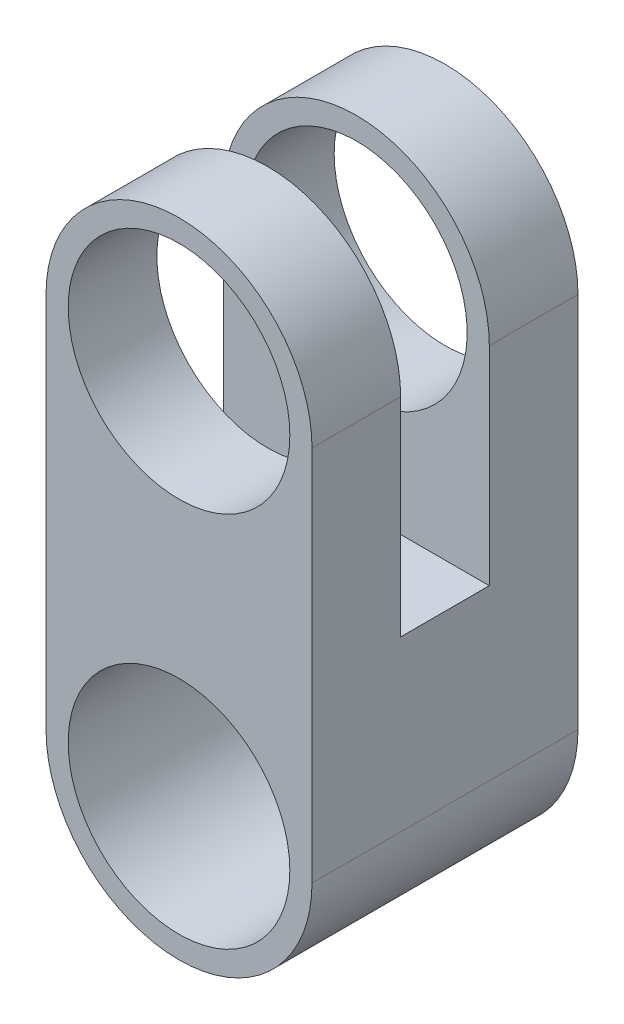
ISO-10303-21;
HEADER;
FILE_DESCRIPTION(('STEP AP214'),'2;1');
FILE_NAME('part.step','',(''),(''),'','','');
FILE_SCHEMA(('AUTOMOTIVE_DESIGN { 1 0 10303 214 1 1 1 1 }'));
ENDSEC;
DATA;
#1=APPLICATION_CONTEXT('core data for automotive mechanical design processes');
#2=APPLICATION_PROTOCOL_DEFINITION('international standard','automotive_design',2000,#1);
#3=PRODUCT_CONTEXT('',#1,'mechanical');
#4=PRODUCT('Part','Part','',(#3));
#5=PRODUCT_RELATED_PRODUCT_CATEGORY('part','',(#4));
#6=PRODUCT_DEFINITION_FORMATION('','',#4);
#7=PRODUCT_DEFINITION_CONTEXT('part definition',#1,'design');
#8=PRODUCT_DEFINITION('design','',#6,#7);
#9=PRODUCT_DEFINITION_SHAPE('','',#8);
#10=(LENGTH_UNIT() NAMED_UNIT(*) SI_UNIT(.MILLI.,.METRE.));
#11=(NAMED_UNIT(*) PLANE_ANGLE_UNIT() SI_UNIT($,.RADIAN.));
#12=(NAMED_UNIT(*) SI_UNIT($,.STERADIAN.) SOLID_ANGLE_UNIT());
#13=UNCERTAINTY_MEASURE_WITH_UNIT(LENGTH_MEASURE(1.E-05),#10,'distance_accuracy_value','');
#14=(GEOMETRIC_REPRESENTATION_CONTEXT(3) GLOBAL_UNCERTAINTY_ASSIGNED_CONTEXT((#13)) GLOBAL_UNIT_ASSIGNED_CONTEXT((#10,
#11,#12)) REPRESENTATION_CONTEXT('',''));
#15=CARTESIAN_POINT('',(0.,0.,0.));
#16=DIRECTION('',(0.,0.,1.));
#17=DIRECTION('',(1.,0.,0.));
#18=AXIS2_PLACEMENT_3D('',#15,#16,#17);
#19=CARTESIAN_POINT('',(0.,37.0662206937284,6.));
#20=DIRECTION('',(0.,0.,-1.));
#21=DIRECTION('',(-1.,0.,0.));
#22=AXIS2_PLACEMENT_3D('',#19,#20,#21);
#23=CYLINDRICAL_SURFACE('',#22,3.);
#24=DIRECTION('',(0.,0.,-1.));
#25=VECTOR('',#24,1.);
#26=CARTESIAN_POINT('',(-3.,37.0662206937284,6.));
#27=LINE('',#26,#25);
#28=CARTESIAN_POINT('',(-3.,37.0662206937284,2.));
#29=VERTEX_POINT('',#28);
#30=CARTESIAN_POINT('',(-3.,37.0662206937284,0.));
#31=VERTEX_POINT('',#30);
#32=EDGE_CURVE('E49',#29,#31,#27,.T.);
#33=ORIENTED_EDGE('',*,*,#32,.F.);
#34=CARTESIAN_POINT('',(0.,37.0662206937284,2.));
#35=DIRECTION('',(0.,0.,-1.));
#36=DIRECTION('',(-1.,0.,0.));
#37=AXIS2_PLACEMENT_3D('',#34,#35,#36);
#38=CIRCLE('',#37,3.);
#39=CARTESIAN_POINT('',(3.,37.0662206937284,2.));
#40=VERTEX_POINT('',#39);
#41=EDGE_CURVE('E156',#29,#40,#38,.T.);
#42=ORIENTED_EDGE('',*,*,#41,.T.);
#43=DIRECTION('',(0.,0.,-1.));
#44=VECTOR('',#43,1.);
#45=CARTESIAN_POINT('',(3.,37.0662206937284,6.));
#46=LINE('',#45,#44);
#47=CARTESIAN_POINT('',(3.,37.0662206937284,0.));
#48=VERTEX_POINT('',#47);
#49=EDGE_CURVE('E88',#40,#48,#46,.T.);
#50=ORIENTED_EDGE('',*,*,#49,.T.);
#51=CARTESIAN_POINT('',(0.,37.0662206937284,0.));
#52=DIRECTION('',(0.,0.,1.));
#53=DIRECTION('',(1.,0.,0.));
#54=AXIS2_PLACEMENT_3D('',#51,#52,#53);
#55=CIRCLE('',#54,3.);
#56=EDGE_CURVE('E172',#48,#31,#55,.T.);
#57=ORIENTED_EDGE('',*,*,#56,.T.);
#58=EDGE_LOOP('',(#33,#42,#50,#57));
#59=FACE_BOUND('',#58,.T.);
#60=ADVANCED_FACE('F39',(#59),#23,.T.);
#61=CARTESIAN_POINT('',(0.,37.0662206937284,6.));
#62=DIRECTION('',(0.,0.,-1.));
#63=DIRECTION('',(-1.,0.,0.));
#64=AXIS2_PLACEMENT_3D('',#61,#62,#63);
#65=CYLINDRICAL_SURFACE('',#64,2.5);
#66=CARTESIAN_POINT('',(0.,37.0662206937284,2.));
#67=DIRECTION('',(0.,0.,-1.));
#68=DIRECTION('',(-1.,0.,0.));
#69=AXIS2_PLACEMENT_3D('',#66,#67,#68);
#70=CIRCLE('',#69,2.5);
#71=CARTESIAN_POINT('',(-2.5,37.0662206937284,2.));
#72=VERTEX_POINT('',#71);
#73=EDGE_CURVE('E43',#72,#72,#70,.T.);
#74=ORIENTED_EDGE('',*,*,#73,.F.);
#75=EDGE_LOOP('',(#74));
#76=FACE_BOUND('',#75,.T.);
#77=CARTESIAN_POINT('',(0.,37.0662206937284,0.));
#78=DIRECTION('',(0.,0.,1.));
#79=DIRECTION('',(1.,0.,0.));
#80=AXIS2_PLACEMENT_3D('',#77,#78,#79);
#81=CIRCLE('',#80,2.5);
#82=CARTESIAN_POINT('',(2.5,37.0662206937284,0.));
#83=VERTEX_POINT('',#82);
#84=EDGE_CURVE('E164',#83,#83,#81,.T.);
#85=ORIENTED_EDGE('',*,*,#84,.F.);
#86=EDGE_LOOP('',(#85));
#87=FACE_BOUND('',#86,.T.);
#88=ADVANCED_FACE('F219',(#76,#87),#65,.F.);
#89=CARTESIAN_POINT('',(0.,37.0662206937284,6.));
#90=DIRECTION('',(0.,0.,1.));
#91=DIRECTION('',(1.,0.,0.));
#92=AXIS2_PLACEMENT_3D('',#89,#90,#91);
#93=PLANE('',#92);
#94=CARTESIAN_POINT('',(0.,37.0662206937284,6.));
#95=DIRECTION('',(0.,0.,1.));
#96=DIRECTION('',(1.,0.,0.));
#97=AXIS2_PLACEMENT_3D('',#94,#95,#96);
#98=CIRCLE('',#97,2.5);
#99=CARTESIAN_POINT('',(2.5,37.0662206937284,6.));
#100=VERTEX_POINT('',#99);
#101=EDGE_CURVE('E168',#100,#100,#98,.T.);
#102=ORIENTED_EDGE('',*,*,#101,.F.);
#103=EDGE_LOOP('',(#102));
#104=FACE_BOUND('',#103,.T.);
#105=CARTESIAN_POINT('',(0.,37.0662206937284,6.));
#106=DIRECTION('',(0.,0.,1.));
#107=DIRECTION('',(1.,0.,0.));
#108=AXIS2_PLACEMENT_3D('',#105,#106,#107);
#109=CIRCLE('',#108,3.);
#110=CARTESIAN_POINT('',(3.,37.0662206937284,6.));
#111=VERTEX_POINT('',#110);
#112=CARTESIAN_POINT('',(-3.,37.0662206937284,6.));
#113=VERTEX_POINT('',#112);
#114=EDGE_CURVE('E176',#111,#113,#109,.T.);
#115=ORIENTED_EDGE('',*,*,#114,.T.);
#116=DIRECTION('',(0.,-1.,0.));
#117=VECTOR('',#116,1.);
#118=CARTESIAN_POINT('',(-3.,37.0662206937284,6.));
#119=LINE('',#118,#117);
#120=CARTESIAN_POINT('',(-3.,28.5662206937284,6.));
#121=VERTEX_POINT('',#120);
#122=EDGE_CURVE('E95',#113,#121,#119,.T.);
#123=ORIENTED_EDGE('',*,*,#122,.T.);
#124=CARTESIAN_POINT('',(0.,28.5662206937284,6.));
#125=DIRECTION('',(0.,0.,1.));
#126=DIRECTION('',(1.,0.,0.));
#127=AXIS2_PLACEMENT_3D('',#124,#125,#126);
#128=CIRCLE('',#127,3.);
#129=CARTESIAN_POINT('',(3.,28.5662206937284,6.));
#130=VERTEX_POINT('',#129);
#131=EDGE_CURVE('E182',#121,#130,#128,.T.);
#132=ORIENTED_EDGE('',*,*,#131,.T.);
#133=DIRECTION('',(0.,1.,0.));
#134=VECTOR('',#133,1.);
#135=CARTESIAN_POINT('',(3.,37.0662206937284,6.));
#136=LINE('',#135,#134);
#137=EDGE_CURVE('E66',#130,#111,#136,.T.);
#138=ORIENTED_EDGE('',*,*,#137,.T.);
#139=EDGE_LOOP('',(#115,#123,#132,#138));
#140=FACE_BOUND('',#139,.T.);
#141=CARTESIAN_POINT('',(0.,28.5662206937284,6.));
#142=DIRECTION('',(0.,0.,1.));
#143=DIRECTION('',(1.,0.,0.));
#144=AXIS2_PLACEMENT_3D('',#141,#142,#143);
#145=CIRCLE('',#144,2.5);
#146=CARTESIAN_POINT('',(2.5,28.5662206937284,6.));
#147=VERTEX_POINT('',#146);
#148=EDGE_CURVE('E160',#147,#147,#145,.T.);
#149=ORIENTED_EDGE('',*,*,#148,.F.);
#150=EDGE_LOOP('',(#149));
#151=FACE_BOUND('',#150,.T.);
#152=ADVANCED_FACE('F222',(#104,#140,#151),#93,.T.);
#153=CARTESIAN_POINT('',(0.,37.0662206937284,0.));
#154=DIRECTION('',(0.,0.,1.));
#155=DIRECTION('',(1.,0.,0.));
#156=AXIS2_PLACEMENT_3D('',#153,#154,#155);
#157=PLANE('',#156);
#158=ORIENTED_EDGE('',*,*,#56,.F.);
#159=DIRECTION('',(0.,1.,0.));
#160=VECTOR('',#159,1.);
#161=CARTESIAN_POINT('',(3.,37.0662206937284,0.));
#162=LINE('',#161,#160);
#163=CARTESIAN_POINT('',(3.,28.5662206937284,0.));
#164=VERTEX_POINT('',#163);
#165=EDGE_CURVE('E179',#164,#48,#162,.T.);
#166=ORIENTED_EDGE('',*,*,#165,.F.);
#167=CARTESIAN_POINT('',(0.,28.5662206937284,0.));
#168=DIRECTION('',(0.,0.,1.));
#169=DIRECTION('',(1.,0.,0.));
#170=AXIS2_PLACEMENT_3D('',#167,#168,#169);
#171=CIRCLE('',#170,3.);
#172=CARTESIAN_POINT('',(-3.,28.5662206937284,0.));
#173=VERTEX_POINT('',#172);
#174=EDGE_CURVE('E192',#173,#164,#171,.T.);
#175=ORIENTED_EDGE('',*,*,#174,.F.);
#176=DIRECTION('',(0.,-1.,0.));
#177=VECTOR('',#176,1.);
#178=CARTESIAN_POINT('',(-3.,37.0662206937284,0.));
#179=LINE('',#178,#177);
#180=EDGE_CURVE('E189',#31,#173,#179,.T.);
#181=ORIENTED_EDGE('',*,*,#180,.F.);
#182=EDGE_LOOP('',(#158,#166,#175,#181));
#183=FACE_BOUND('',#182,.T.);
#184=ORIENTED_EDGE('',*,*,#84,.T.);
#185=EDGE_LOOP('',(#184));
#186=FACE_BOUND('',#185,.T.);
#187=CARTESIAN_POINT('',(0.,28.5662206937284,0.));
#188=DIRECTION('',(0.,0.,1.));
#189=DIRECTION('',(1.,0.,0.));
#190=AXIS2_PLACEMENT_3D('',#187,#188,#189);
#191=CIRCLE('',#190,2.5);
#192=CARTESIAN_POINT('',(2.5,28.5662206937284,0.));
#193=VERTEX_POINT('',#192);
#194=EDGE_CURVE('E159',#193,#193,#191,.T.);
#195=ORIENTED_EDGE('',*,*,#194,.T.);
#196=EDGE_LOOP('',(#195));
#197=FACE_BOUND('',#196,.T.);
#198=ADVANCED_FACE('F224',(#183,#186,#197),#157,.F.);
#199=CARTESIAN_POINT('',(3.,37.0662206937284,4.));
#200=VERTEX_POINT('',#199);
#201=EDGE_CURVE('E197',#111,#200,#46,.T.);
#202=ORIENTED_EDGE('',*,*,#201,.T.);
#203=CARTESIAN_POINT('',(0.,37.0662206937284,4.));
#204=DIRECTION('',(0.,0.,1.));
#205=DIRECTION('',(1.,0.,0.));
#206=AXIS2_PLACEMENT_3D('',#203,#204,#205);
#207=CIRCLE('',#206,3.);
#208=CARTESIAN_POINT('',(-3.,37.0662206937284,4.));
#209=VERTEX_POINT('',#208);
#210=EDGE_CURVE('E57',#200,#209,#207,.T.);
#211=ORIENTED_EDGE('',*,*,#210,.T.);
#212=EDGE_CURVE('E11',#113,#209,#27,.T.);
#213=ORIENTED_EDGE('',*,*,#212,.F.);
#214=ORIENTED_EDGE('',*,*,#114,.F.);
#215=EDGE_LOOP('',(#202,#211,#213,#214));
#216=FACE_BOUND('',#215,.T.);
#217=ADVANCED_FACE('F41',(#216),#23,.T.);
#218=CARTESIAN_POINT('',(-3.,37.0662206937284,6.));
#219=DIRECTION('',(1.,0.,0.));
#220=DIRECTION('',(0.,1.,0.));
#221=AXIS2_PLACEMENT_3D('',#218,#219,#220);
#222=PLANE('',#221);
#223=DIRECTION('',(0.,0.,1.));
#224=VECTOR('',#223,1.);
#225=CARTESIAN_POINT('',(-3.,32.3763232949486,2.));
#226=LINE('',#225,#224);
#227=CARTESIAN_POINT('',(-3.,32.3763232949486,2.));
#228=VERTEX_POINT('',#227);
#229=CARTESIAN_POINT('',(-3.,32.3763232949486,4.));
#230=VERTEX_POINT('',#229);
#231=EDGE_CURVE('E141',#228,#230,#226,.T.);
#232=ORIENTED_EDGE('',*,*,#231,.F.);
#233=DIRECTION('',(0.,-1.,0.));
#234=VECTOR('',#233,1.);
#235=CARTESIAN_POINT('',(-3.,37.0662206937284,2.));
#236=LINE('',#235,#234);
#237=EDGE_CURVE('E123',#29,#228,#236,.T.);
#238=ORIENTED_EDGE('',*,*,#237,.F.);
#239=ORIENTED_EDGE('',*,*,#32,.T.);
#240=ORIENTED_EDGE('',*,*,#180,.T.);
#241=DIRECTION('',(0.,0.,-1.));
#242=VECTOR('',#241,1.);
#243=CARTESIAN_POINT('',(-3.,28.5662206937284,6.));
#244=LINE('',#243,#242);
#245=EDGE_CURVE('E205',#121,#173,#244,.T.);
#246=ORIENTED_EDGE('',*,*,#245,.F.);
#247=ORIENTED_EDGE('',*,*,#122,.F.);
#248=ORIENTED_EDGE('',*,*,#212,.T.);
#249=DIRECTION('',(0.,1.,0.));
#250=VECTOR('',#249,1.);
#251=CARTESIAN_POINT('',(-3.,41.7923974861042,4.));
#252=LINE('',#251,#250);
#253=EDGE_CURVE('E144',#230,#209,#252,.T.);
#254=ORIENTED_EDGE('',*,*,#253,.F.);
#255=EDGE_LOOP('',(#232,#238,#239,#240,#246,#247,#248,#254));
#256=FACE_BOUND('',#255,.T.);
#257=ADVANCED_FACE('F242',(#256),#222,.F.);
#258=CARTESIAN_POINT('',(0.,28.5662206937284,6.));
#259=DIRECTION('',(0.,0.,-1.));
#260=DIRECTION('',(-1.,0.,0.));
#261=AXIS2_PLACEMENT_3D('',#258,#259,#260);
#262=CYLINDRICAL_SURFACE('',#261,3.);
#263=ORIENTED_EDGE('',*,*,#174,.T.);
#264=DIRECTION('',(0.,0.,-1.));
#265=VECTOR('',#264,1.);
#266=CARTESIAN_POINT('',(3.,28.5662206937284,6.));
#267=LINE('',#266,#265);
#268=EDGE_CURVE('E201',#130,#164,#267,.T.);
#269=ORIENTED_EDGE('',*,*,#268,.F.);
#270=ORIENTED_EDGE('',*,*,#131,.F.);
#271=ORIENTED_EDGE('',*,*,#245,.T.);
#272=EDGE_LOOP('',(#263,#269,#270,#271));
#273=FACE_BOUND('',#272,.T.);
#274=ADVANCED_FACE('F298',(#273),#262,.T.);
#275=CARTESIAN_POINT('',(3.,37.0662206937284,6.));
#276=DIRECTION('',(-1.,0.,0.));
#277=DIRECTION('',(0.,-1.,0.));
#278=AXIS2_PLACEMENT_3D('',#275,#276,#277);
#279=PLANE('',#278);
#280=ORIENTED_EDGE('',*,*,#49,.F.);
#281=DIRECTION('',(0.,-1.,0.));
#282=VECTOR('',#281,1.);
#283=CARTESIAN_POINT('',(3.,37.0662206937284,2.));
#284=LINE('',#283,#282);
#285=CARTESIAN_POINT('',(3.,32.3763232949486,2.));
#286=VERTEX_POINT('',#285);
#287=EDGE_CURVE('E121',#40,#286,#284,.T.);
#288=ORIENTED_EDGE('',*,*,#287,.T.);
#289=DIRECTION('',(0.,0.,1.));
#290=VECTOR('',#289,1.);
#291=CARTESIAN_POINT('',(3.,32.3763232949486,2.));
#292=LINE('',#291,#290);
#293=CARTESIAN_POINT('',(3.,32.3763232949486,4.));
#294=VERTEX_POINT('',#293);
#295=EDGE_CURVE('E129',#286,#294,#292,.T.);
#296=ORIENTED_EDGE('',*,*,#295,.T.);
#297=DIRECTION('',(0.,1.,0.));
#298=VECTOR('',#297,1.);
#299=CARTESIAN_POINT('',(3.,32.3763232949486,4.));
#300=LINE('',#299,#298);
#301=EDGE_CURVE('E138',#294,#200,#300,.T.);
#302=ORIENTED_EDGE('',*,*,#301,.T.);
#303=ORIENTED_EDGE('',*,*,#201,.F.);
#304=ORIENTED_EDGE('',*,*,#137,.F.);
#305=ORIENTED_EDGE('',*,*,#268,.T.);
#306=ORIENTED_EDGE('',*,*,#165,.T.);
#307=EDGE_LOOP('',(#280,#288,#296,#302,#303,#304,#305,#306));
#308=FACE_BOUND('',#307,.T.);
#309=ADVANCED_FACE('F136',(#308),#279,.F.);
#310=CARTESIAN_POINT('',(0.,37.0662206937284,4.));
#311=DIRECTION('',(0.,0.,1.));
#312=DIRECTION('',(1.,0.,0.));
#313=AXIS2_PLACEMENT_3D('',#310,#311,#312);
#314=CIRCLE('',#313,2.5);
#315=CARTESIAN_POINT('',(2.5,37.0662206937284,4.));
#316=VERTEX_POINT('',#315);
#317=EDGE_CURVE('E152',#316,#316,#314,.T.);
#318=ORIENTED_EDGE('',*,*,#317,.F.);
#319=EDGE_LOOP('',(#318));
#320=FACE_BOUND('',#319,.T.);
#321=ORIENTED_EDGE('',*,*,#101,.T.);
#322=EDGE_LOOP('',(#321));
#323=FACE_BOUND('',#322,.T.);
#324=ADVANCED_FACE('F214',(#320,#323),#65,.F.);
#325=CARTESIAN_POINT('',(0.,28.5662206937284,6.));
#326=DIRECTION('',(0.,0.,-1.));
#327=DIRECTION('',(-1.,0.,0.));
#328=AXIS2_PLACEMENT_3D('',#325,#326,#327);
#329=CYLINDRICAL_SURFACE('',#328,2.5);
#330=ORIENTED_EDGE('',*,*,#148,.T.);
#331=EDGE_LOOP('',(#330));
#332=FACE_BOUND('',#331,.T.);
#333=ORIENTED_EDGE('',*,*,#194,.F.);
#334=EDGE_LOOP('',(#333));
#335=FACE_BOUND('',#334,.T.);
#336=ADVANCED_FACE('F217',(#332,#335),#329,.F.);
#337=CARTESIAN_POINT('',(3.,37.0662206937284,2.));
#338=DIRECTION('',(0.,0.,-1.));
#339=DIRECTION('',(-1.,0.,0.));
#340=AXIS2_PLACEMENT_3D('',#337,#338,#339);
#341=PLANE('',#340);
#342=ORIENTED_EDGE('',*,*,#73,.T.);
#343=EDGE_LOOP('',(#342));
#344=FACE_BOUND('',#343,.T.);
#345=ORIENTED_EDGE('',*,*,#237,.T.);
#346=DIRECTION('',(-1.,0.,0.));
#347=VECTOR('',#346,1.);
#348=CARTESIAN_POINT('',(3.,32.3763232949486,2.));
#349=LINE('',#348,#347);
#350=EDGE_CURVE('E117',#286,#228,#349,.T.);
#351=ORIENTED_EDGE('',*,*,#350,.F.);
#352=ORIENTED_EDGE('',*,*,#287,.F.);
#353=ORIENTED_EDGE('',*,*,#41,.F.);
#354=EDGE_LOOP('',(#345,#351,#352,#353));
#355=FACE_BOUND('',#354,.T.);
#356=ADVANCED_FACE('F119',(#344,#355),#341,.F.);
#357=CARTESIAN_POINT('',(3.,41.7923974861042,4.));
#358=DIRECTION('',(0.,0.,1.));
#359=DIRECTION('',(1.,0.,0.));
#360=AXIS2_PLACEMENT_3D('',#357,#358,#359);
#361=PLANE('',#360);
#362=ORIENTED_EDGE('',*,*,#317,.T.);
#363=EDGE_LOOP('',(#362));
#364=FACE_BOUND('',#363,.T.);
#365=ORIENTED_EDGE('',*,*,#301,.F.);
#366=DIRECTION('',(-1.,0.,0.));
#367=VECTOR('',#366,1.);
#368=CARTESIAN_POINT('',(3.,32.3763232949486,4.));
#369=LINE('',#368,#367);
#370=EDGE_CURVE('E128',#294,#230,#369,.T.);
#371=ORIENTED_EDGE('',*,*,#370,.T.);
#372=ORIENTED_EDGE('',*,*,#253,.T.);
#373=ORIENTED_EDGE('',*,*,#210,.F.);
#374=EDGE_LOOP('',(#365,#371,#372,#373));
#375=FACE_BOUND('',#374,.T.);
#376=ADVANCED_FACE('F212',(#364,#375),#361,.F.);
#377=CARTESIAN_POINT('',(3.,32.3763232949486,2.));
#378=DIRECTION('',(0.,-1.,0.));
#379=DIRECTION('',(0.,0.,-1.));
#380=AXIS2_PLACEMENT_3D('',#377,#378,#379);
#381=PLANE('',#380);
#382=ORIENTED_EDGE('',*,*,#231,.T.);
#383=ORIENTED_EDGE('',*,*,#370,.F.);
#384=ORIENTED_EDGE('',*,*,#295,.F.);
#385=ORIENTED_EDGE('',*,*,#350,.T.);
#386=EDGE_LOOP('',(#382,#383,#384,#385));
#387=FACE_BOUND('',#386,.T.);
#388=ADVANCED_FACE('F132',(#387),#381,.F.);
#389=CLOSED_SHELL('',(#60,#88,#152,#198,#217,#257,#274,#309,#324,#336,#356,#376,#388));
#390=MANIFOLD_SOLID_BREP('B2',#389);
#391=ADVANCED_BREP_SHAPE_REPRESENTATION('',(#18,#390),#14);
#392=SHAPE_DEFINITION_REPRESENTATION(#9,#391);
ENDSEC;
END-ISO-10303-21;
